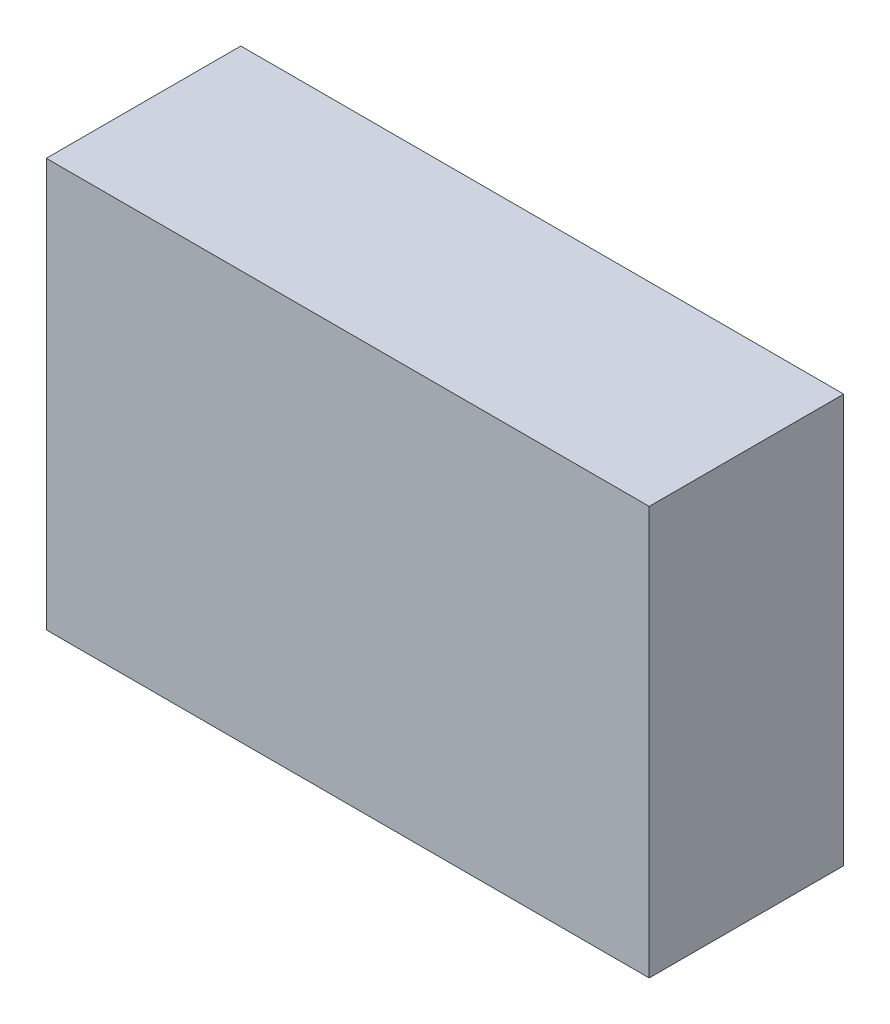
ISO-10303-21;
HEADER;
FILE_DESCRIPTION(('STEP AP214'),'2;1');
FILE_NAME('part.step','',(''),(''),'','','');
FILE_SCHEMA(('AUTOMOTIVE_DESIGN { 1 0 10303 214 1 1 1 1 }'));
ENDSEC;
DATA;
#1=APPLICATION_CONTEXT('core data for automotive mechanical design processes');
#2=APPLICATION_PROTOCOL_DEFINITION('international standard','automotive_design',2000,#1);
#3=PRODUCT_CONTEXT('',#1,'mechanical');
#4=PRODUCT('Part','Part','',(#3));
#5=PRODUCT_RELATED_PRODUCT_CATEGORY('part','',(#4));
#6=PRODUCT_DEFINITION_FORMATION('','',#4);
#7=PRODUCT_DEFINITION_CONTEXT('part definition',#1,'design');
#8=PRODUCT_DEFINITION('design','',#6,#7);
#9=PRODUCT_DEFINITION_SHAPE('','',#8);
#10=(LENGTH_UNIT() NAMED_UNIT(*) SI_UNIT(.MILLI.,.METRE.));
#11=(NAMED_UNIT(*) PLANE_ANGLE_UNIT() SI_UNIT($,.RADIAN.));
#12=(NAMED_UNIT(*) SI_UNIT($,.STERADIAN.) SOLID_ANGLE_UNIT());
#13=UNCERTAINTY_MEASURE_WITH_UNIT(LENGTH_MEASURE(1.E-05),#10,'distance_accuracy_value','');
#14=(GEOMETRIC_REPRESENTATION_CONTEXT(3) GLOBAL_UNCERTAINTY_ASSIGNED_CONTEXT((#13)) GLOBAL_UNIT_ASSIGNED_CONTEXT((#10,
#11,#12)) REPRESENTATION_CONTEXT('',''));
#15=CARTESIAN_POINT('',(0.,0.,0.));
#16=DIRECTION('',(0.,0.,1.));
#17=DIRECTION('',(1.,0.,0.));
#18=AXIS2_PLACEMENT_3D('',#15,#16,#17);
#19=CARTESIAN_POINT('',(-31.,-21.,20.));
#20=DIRECTION('',(1.,0.,0.));
#21=DIRECTION('',(0.,0.,-1.));
#22=AXIS2_PLACEMENT_3D('',#19,#20,#21);
#23=PLANE('',#22);
#24=DIRECTION('',(0.,-1.,0.));
#25=VECTOR('',#24,1.);
#26=CARTESIAN_POINT('',(-31.,-21.,0.));
#27=LINE('',#26,#25);
#28=CARTESIAN_POINT('',(-31.,21.,0.));
#29=VERTEX_POINT('',#28);
#30=CARTESIAN_POINT('',(-31.,-21.,0.));
#31=VERTEX_POINT('',#30);
#32=EDGE_CURVE('E96',#29,#31,#27,.T.);
#33=ORIENTED_EDGE('',*,*,#32,.T.);
#34=DIRECTION('',(0.,0.,-1.));
#35=VECTOR('',#34,1.);
#36=CARTESIAN_POINT('',(-31.,-21.,20.));
#37=LINE('',#36,#35);
#38=CARTESIAN_POINT('',(-31.,-21.,20.));
#39=VERTEX_POINT('',#38);
#40=EDGE_CURVE('E11',#39,#31,#37,.T.);
#41=ORIENTED_EDGE('',*,*,#40,.F.);
#42=DIRECTION('',(0.,-1.,0.));
#43=VECTOR('',#42,1.);
#44=CARTESIAN_POINT('',(-31.,-21.,20.));
#45=LINE('',#44,#43);
#46=CARTESIAN_POINT('',(-31.,21.,20.));
#47=VERTEX_POINT('',#46);
#48=EDGE_CURVE('E84',#47,#39,#45,.T.);
#49=ORIENTED_EDGE('',*,*,#48,.F.);
#50=DIRECTION('',(0.,0.,-1.));
#51=VECTOR('',#50,1.);
#52=CARTESIAN_POINT('',(-31.,21.,20.));
#53=LINE('',#52,#51);
#54=EDGE_CURVE('E92',#47,#29,#53,.T.);
#55=ORIENTED_EDGE('',*,*,#54,.T.);
#56=EDGE_LOOP('',(#33,#41,#49,#55));
#57=FACE_BOUND('',#56,.T.);
#58=ADVANCED_FACE('F33',(#57),#23,.F.);
#59=CARTESIAN_POINT('',(-31.,-21.,20.));
#60=DIRECTION('',(0.,1.,0.));
#61=DIRECTION('',(0.,0.,1.));
#62=AXIS2_PLACEMENT_3D('',#59,#60,#61);
#63=PLANE('',#62);
#64=DIRECTION('',(1.,0.,0.));
#65=VECTOR('',#64,1.);
#66=CARTESIAN_POINT('',(-31.,-21.,0.));
#67=LINE('',#66,#65);
#68=CARTESIAN_POINT('',(31.,-21.,0.));
#69=VERTEX_POINT('',#68);
#70=EDGE_CURVE('E88',#31,#69,#67,.T.);
#71=ORIENTED_EDGE('',*,*,#70,.T.);
#72=DIRECTION('',(0.,0.,-1.));
#73=VECTOR('',#72,1.);
#74=CARTESIAN_POINT('',(31.,-21.,20.));
#75=LINE('',#74,#73);
#76=CARTESIAN_POINT('',(31.,-21.,20.));
#77=VERTEX_POINT('',#76);
#78=EDGE_CURVE('E41',#77,#69,#75,.T.);
#79=ORIENTED_EDGE('',*,*,#78,.F.);
#80=DIRECTION('',(1.,0.,0.));
#81=VECTOR('',#80,1.);
#82=CARTESIAN_POINT('',(-31.,-21.,20.));
#83=LINE('',#82,#81);
#84=EDGE_CURVE('E79',#39,#77,#83,.T.);
#85=ORIENTED_EDGE('',*,*,#84,.F.);
#86=ORIENTED_EDGE('',*,*,#40,.T.);
#87=EDGE_LOOP('',(#71,#79,#85,#86));
#88=FACE_BOUND('',#87,.T.);
#89=ADVANCED_FACE('F87',(#88),#63,.F.);
#90=CARTESIAN_POINT('',(31.,-21.,20.));
#91=DIRECTION('',(-1.,0.,0.));
#92=DIRECTION('',(0.,0.,1.));
#93=AXIS2_PLACEMENT_3D('',#90,#91,#92);
#94=PLANE('',#93);
#95=DIRECTION('',(0.,1.,0.));
#96=VECTOR('',#95,1.);
#97=CARTESIAN_POINT('',(31.,-21.,0.));
#98=LINE('',#97,#96);
#99=CARTESIAN_POINT('',(31.,21.,0.));
#100=VERTEX_POINT('',#99);
#101=EDGE_CURVE('E66',#69,#100,#98,.T.);
#102=ORIENTED_EDGE('',*,*,#101,.T.);
#103=DIRECTION('',(0.,0.,-1.));
#104=VECTOR('',#103,1.);
#105=CARTESIAN_POINT('',(31.,21.,20.));
#106=LINE('',#105,#104);
#107=CARTESIAN_POINT('',(31.,21.,20.));
#108=VERTEX_POINT('',#107);
#109=EDGE_CURVE('E89',#108,#100,#106,.T.);
#110=ORIENTED_EDGE('',*,*,#109,.F.);
#111=DIRECTION('',(0.,1.,0.));
#112=VECTOR('',#111,1.);
#113=CARTESIAN_POINT('',(31.,-21.,20.));
#114=LINE('',#113,#112);
#115=EDGE_CURVE('E82',#77,#108,#114,.T.);
#116=ORIENTED_EDGE('',*,*,#115,.F.);
#117=ORIENTED_EDGE('',*,*,#78,.T.);
#118=EDGE_LOOP('',(#102,#110,#116,#117));
#119=FACE_BOUND('',#118,.T.);
#120=ADVANCED_FACE('F90',(#119),#94,.F.);
#121=CARTESIAN_POINT('',(-31.,21.,20.));
#122=DIRECTION('',(0.,-1.,0.));
#123=DIRECTION('',(0.,0.,-1.));
#124=AXIS2_PLACEMENT_3D('',#121,#122,#123);
#125=PLANE('',#124);
#126=DIRECTION('',(-1.,0.,0.));
#127=VECTOR('',#126,1.);
#128=CARTESIAN_POINT('',(-31.,21.,0.));
#129=LINE('',#128,#127);
#130=EDGE_CURVE('E72',#100,#29,#129,.T.);
#131=ORIENTED_EDGE('',*,*,#130,.T.);
#132=ORIENTED_EDGE('',*,*,#54,.F.);
#133=DIRECTION('',(-1.,0.,0.));
#134=VECTOR('',#133,1.);
#135=CARTESIAN_POINT('',(-31.,21.,20.));
#136=LINE('',#135,#134);
#137=EDGE_CURVE('E49',#108,#47,#136,.T.);
#138=ORIENTED_EDGE('',*,*,#137,.F.);
#139=ORIENTED_EDGE('',*,*,#109,.T.);
#140=EDGE_LOOP('',(#131,#132,#138,#139));
#141=FACE_BOUND('',#140,.T.);
#142=ADVANCED_FACE('F103',(#141),#125,.F.);
#143=CARTESIAN_POINT('',(0.,0.,20.));
#144=DIRECTION('',(0.,0.,-1.));
#145=DIRECTION('',(-1.,0.,0.));
#146=AXIS2_PLACEMENT_3D('',#143,#144,#145);
#147=PLANE('',#146);
#148=ORIENTED_EDGE('',*,*,#48,.T.);
#149=ORIENTED_EDGE('',*,*,#84,.T.);
#150=ORIENTED_EDGE('',*,*,#115,.T.);
#151=ORIENTED_EDGE('',*,*,#137,.T.);
#152=EDGE_LOOP('',(#148,#149,#150,#151));
#153=FACE_BOUND('',#152,.T.);
#154=ADVANCED_FACE('F80',(#153),#147,.F.);
#155=CARTESIAN_POINT('',(0.,0.,0.));
#156=DIRECTION('',(0.,0.,-1.));
#157=DIRECTION('',(-1.,0.,0.));
#158=AXIS2_PLACEMENT_3D('',#155,#156,#157);
#159=PLANE('',#158);
#160=ORIENTED_EDGE('',*,*,#32,.F.);
#161=ORIENTED_EDGE('',*,*,#130,.F.);
#162=ORIENTED_EDGE('',*,*,#101,.F.);
#163=ORIENTED_EDGE('',*,*,#70,.F.);
#164=EDGE_LOOP('',(#160,#161,#162,#163));
#165=FACE_BOUND('',#164,.T.);
#166=ADVANCED_FACE('F106',(#165),#159,.T.);
#167=CLOSED_SHELL('',(#58,#89,#120,#142,#154,#166));
#168=MANIFOLD_SOLID_BREP('B2',#167);
#169=ADVANCED_BREP_SHAPE_REPRESENTATION('',(#18,#168),#14);
#170=SHAPE_DEFINITION_REPRESENTATION(#9,#169);
ENDSEC;
END-ISO-10303-21;
